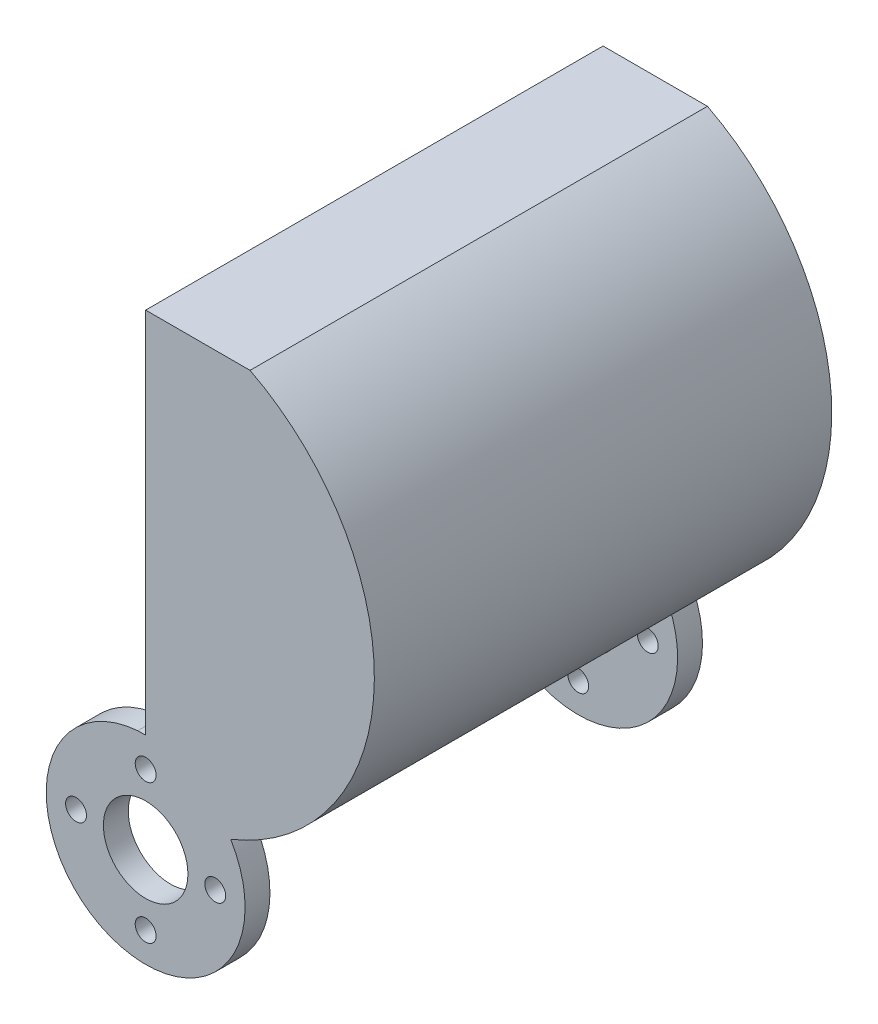
ISO-10303-21;
HEADER;
FILE_DESCRIPTION(('STEP AP214'),'2;1');
FILE_NAME('part.step','',(''),(''),'','','');
FILE_SCHEMA(('AUTOMOTIVE_DESIGN { 1 0 10303 214 1 1 1 1 }'));
ENDSEC;
DATA;
#1=APPLICATION_CONTEXT('core data for automotive mechanical design processes');
#2=APPLICATION_PROTOCOL_DEFINITION('international standard','automotive_design',2000,#1);
#3=PRODUCT_CONTEXT('',#1,'mechanical');
#4=PRODUCT('Part','Part','',(#3));
#5=PRODUCT_RELATED_PRODUCT_CATEGORY('part','',(#4));
#6=PRODUCT_DEFINITION_FORMATION('','',#4);
#7=PRODUCT_DEFINITION_CONTEXT('part definition',#1,'design');
#8=PRODUCT_DEFINITION('design','',#6,#7);
#9=PRODUCT_DEFINITION_SHAPE('','',#8);
#10=(LENGTH_UNIT() NAMED_UNIT(*) SI_UNIT(.MILLI.,.METRE.));
#11=(NAMED_UNIT(*) PLANE_ANGLE_UNIT() SI_UNIT($,.RADIAN.));
#12=(NAMED_UNIT(*) SI_UNIT($,.STERADIAN.) SOLID_ANGLE_UNIT());
#13=UNCERTAINTY_MEASURE_WITH_UNIT(LENGTH_MEASURE(1.E-05),#10,'distance_accuracy_value','');
#14=(GEOMETRIC_REPRESENTATION_CONTEXT(3) GLOBAL_UNCERTAINTY_ASSIGNED_CONTEXT((#13)) GLOBAL_UNIT_ASSIGNED_CONTEXT((#10,
#11,#12)) REPRESENTATION_CONTEXT('',''));
#15=CARTESIAN_POINT('',(0.,0.,0.));
#16=DIRECTION('',(0.,0.,1.));
#17=DIRECTION('',(1.,0.,0.));
#18=AXIS2_PLACEMENT_3D('',#15,#16,#17);
#19=CARTESIAN_POINT('',(0.,26.5366180703189,23.));
#20=DIRECTION('',(0.,0.,-1.));
#21=DIRECTION('',(-1.,0.,0.));
#22=AXIS2_PLACEMENT_3D('',#19,#20,#21);
#23=CYLINDRICAL_SURFACE('',#22,20.);
#24=CARTESIAN_POINT('',(0.,26.5366180703189,21.));
#25=DIRECTION('',(0.,0.,1.));
#26=DIRECTION('',(1.,0.,0.));
#27=AXIS2_PLACEMENT_3D('',#24,#25,#26);
#28=CIRCLE('',#27,20.);
#29=CARTESIAN_POINT('',(11.2019848851942,9.96810773800832,21.));
#30=VERTEX_POINT('',#29);
#31=CARTESIAN_POINT('',(18.8925108229469,19.9736130570011,21.));
#32=VERTEX_POINT('',#31);
#33=EDGE_CURVE('E281',#30,#32,#28,.T.);
#34=ORIENTED_EDGE('',*,*,#33,.T.);
#35=DIRECTION('',(0.,0.,-1.));
#36=VECTOR('',#35,1.);
#37=CARTESIAN_POINT('',(18.8925108229469,19.9736130570011,40.8613024708278));
#38=LINE('',#37,#36);
#39=CARTESIAN_POINT('',(18.8925108229469,19.9736130570011,-21.));
#40=VERTEX_POINT('',#39);
#41=EDGE_CURVE('E199',#32,#40,#38,.T.);
#42=ORIENTED_EDGE('',*,*,#41,.T.);
#43=CARTESIAN_POINT('',(0.,26.5366180703189,-21.));
#44=DIRECTION('',(0.,0.,1.));
#45=DIRECTION('',(1.,0.,0.));
#46=AXIS2_PLACEMENT_3D('',#43,#44,#45);
#47=CIRCLE('',#46,20.);
#48=CARTESIAN_POINT('',(11.2019848851942,9.96810773800832,-21.));
#49=VERTEX_POINT('',#48);
#50=EDGE_CURVE('E263',#49,#40,#47,.T.);
#51=ORIENTED_EDGE('',*,*,#50,.F.);
#52=DIRECTION('',(0.,0.,-1.));
#53=VECTOR('',#52,1.);
#54=CARTESIAN_POINT('',(11.2019848851942,9.96810773800832,23.));
#55=LINE('',#54,#53);
#56=EDGE_CURVE('E319',#30,#49,#55,.T.);
#57=ORIENTED_EDGE('',*,*,#56,.F.);
#58=EDGE_LOOP('',(#34,#42,#51,#57));
#59=FACE_BOUND('',#58,.T.);
#60=ADVANCED_FACE('F45',(#59),#23,.F.);
#61=CARTESIAN_POINT('',(19.6542616371196,22.8339164215697,-21.));
#62=VERTEX_POINT('',#61);
#63=CARTESIAN_POINT('',(7.6878818746599,45.,-21.));
#64=VERTEX_POINT('',#63);
#65=EDGE_CURVE('E262',#62,#64,#47,.T.);
#66=ORIENTED_EDGE('',*,*,#65,.F.);
#67=DIRECTION('',(0.,0.,-1.));
#68=VECTOR('',#67,1.);
#69=CARTESIAN_POINT('',(19.6542616371196,22.8339164215697,40.8613024708278));
#70=LINE('',#69,#68);
#71=CARTESIAN_POINT('',(19.6542616371196,22.8339164215697,21.));
#72=VERTEX_POINT('',#71);
#73=EDGE_CURVE('E60',#72,#62,#70,.T.);
#74=ORIENTED_EDGE('',*,*,#73,.F.);
#75=CARTESIAN_POINT('',(7.6878818746599,45.,21.));
#76=VERTEX_POINT('',#75);
#77=EDGE_CURVE('E280',#72,#76,#28,.T.);
#78=ORIENTED_EDGE('',*,*,#77,.T.);
#79=DIRECTION('',(0.,0.,-1.));
#80=VECTOR('',#79,1.);
#81=CARTESIAN_POINT('',(7.6878818746599,45.,23.));
#82=LINE('',#81,#80);
#83=EDGE_CURVE('E347',#76,#64,#82,.T.);
#84=ORIENTED_EDGE('',*,*,#83,.T.);
#85=EDGE_LOOP('',(#66,#74,#78,#84));
#86=FACE_BOUND('',#85,.T.);
#87=ADVANCED_FACE('F417',(#86),#23,.F.);
#88=CARTESIAN_POINT('',(0.,26.5366180703189,21.));
#89=DIRECTION('',(0.,0.,1.));
#90=DIRECTION('',(1.,0.,0.));
#91=AXIS2_PLACEMENT_3D('',#88,#89,#90);
#92=PLANE('',#91);
#93=DIRECTION('',(1.,0.,0.));
#94=VECTOR('',#93,1.);
#95=CARTESIAN_POINT('',(0.,19.9736130570011,21.));
#96=LINE('',#95,#94);
#97=CARTESIAN_POINT('',(0.,19.9736130570011,21.));
#98=VERTEX_POINT('',#97);
#99=EDGE_CURVE('E68',#98,#32,#96,.T.);
#100=ORIENTED_EDGE('',*,*,#99,.T.);
#101=ORIENTED_EDGE('',*,*,#33,.F.);
#102=DIRECTION('',(1.,0.,0.));
#103=VECTOR('',#102,1.);
#104=CARTESIAN_POINT('',(11.2019848851942,9.96810773800832,21.));
#105=LINE('',#104,#103);
#106=CARTESIAN_POINT('',(0.,9.96810773800832,21.));
#107=VERTEX_POINT('',#106);
#108=EDGE_CURVE('E277',#107,#30,#105,.T.);
#109=ORIENTED_EDGE('',*,*,#108,.F.);
#110=DIRECTION('',(0.,-1.,0.));
#111=VECTOR('',#110,1.);
#112=CARTESIAN_POINT('',(0.,47.,21.));
#113=LINE('',#112,#111);
#114=EDGE_CURVE('E278',#98,#107,#113,.T.);
#115=ORIENTED_EDGE('',*,*,#114,.F.);
#116=EDGE_LOOP('',(#100,#101,#109,#115));
#117=FACE_BOUND('',#116,.T.);
#118=ADVANCED_FACE('F424',(#117),#92,.F.);
#119=DIRECTION('',(-1.,0.,0.));
#120=VECTOR('',#119,1.);
#121=CARTESIAN_POINT('',(0.,22.8339164215697,21.));
#122=LINE('',#121,#120);
#123=CARTESIAN_POINT('',(0.,22.8339164215697,21.));
#124=VERTEX_POINT('',#123);
#125=EDGE_CURVE('E196',#72,#124,#122,.T.);
#126=ORIENTED_EDGE('',*,*,#125,.T.);
#127=CARTESIAN_POINT('',(0.,47.,21.));
#128=VERTEX_POINT('',#127);
#129=EDGE_CURVE('E190',#128,#124,#113,.T.);
#130=ORIENTED_EDGE('',*,*,#129,.F.);
#131=DIRECTION('',(-0.866025403784438,0.500000000000001,0.));
#132=VECTOR('',#131,1.);
#133=CARTESIAN_POINT('',(0.,47.,21.));
#134=LINE('',#133,#132);
#135=CARTESIAN_POINT('',(3.46410161513775,45.,21.));
#136=VERTEX_POINT('',#135);
#137=EDGE_CURVE('E285',#136,#128,#134,.T.);
#138=ORIENTED_EDGE('',*,*,#137,.F.);
#139=DIRECTION('',(-1.,0.,0.));
#140=VECTOR('',#139,1.);
#141=CARTESIAN_POINT('',(3.46410161513775,45.,21.));
#142=LINE('',#141,#140);
#143=EDGE_CURVE('E283',#76,#136,#142,.T.);
#144=ORIENTED_EDGE('',*,*,#143,.F.);
#145=ORIENTED_EDGE('',*,*,#77,.F.);
#146=EDGE_LOOP('',(#126,#130,#138,#144,#145));
#147=FACE_BOUND('',#146,.T.);
#148=ADVANCED_FACE('F486',(#147),#92,.F.);
#149=CARTESIAN_POINT('',(0.,26.5366180703189,-21.));
#150=DIRECTION('',(0.,0.,-1.));
#151=DIRECTION('',(1.,0.,0.));
#152=AXIS2_PLACEMENT_3D('',#149,#150,#151);
#153=PLANE('',#152);
#154=DIRECTION('',(1.,0.,0.));
#155=VECTOR('',#154,1.);
#156=CARTESIAN_POINT('',(0.,19.9736130570011,-21.));
#157=LINE('',#156,#155);
#158=CARTESIAN_POINT('',(0.,19.9736130570011,-21.));
#159=VERTEX_POINT('',#158);
#160=EDGE_CURVE('E202',#159,#40,#157,.T.);
#161=ORIENTED_EDGE('',*,*,#160,.F.);
#162=DIRECTION('',(0.,-1.,0.));
#163=VECTOR('',#162,1.);
#164=CARTESIAN_POINT('',(0.,47.,-21.));
#165=LINE('',#164,#163);
#166=CARTESIAN_POINT('',(0.,9.96810773800832,-21.));
#167=VERTEX_POINT('',#166);
#168=EDGE_CURVE('E181',#159,#167,#165,.T.);
#169=ORIENTED_EDGE('',*,*,#168,.T.);
#170=DIRECTION('',(1.,0.,0.));
#171=VECTOR('',#170,1.);
#172=CARTESIAN_POINT('',(11.2019848851942,9.96810773800832,-21.));
#173=LINE('',#172,#171);
#174=EDGE_CURVE('E266',#167,#49,#173,.T.);
#175=ORIENTED_EDGE('',*,*,#174,.T.);
#176=ORIENTED_EDGE('',*,*,#50,.T.);
#177=EDGE_LOOP('',(#161,#169,#175,#176));
#178=FACE_BOUND('',#177,.T.);
#179=ADVANCED_FACE('F474',(#178),#153,.F.);
#180=DIRECTION('',(-1.,0.,0.));
#181=VECTOR('',#180,1.);
#182=CARTESIAN_POINT('',(0.,22.8339164215697,-21.));
#183=LINE('',#182,#181);
#184=CARTESIAN_POINT('',(0.,22.8339164215697,-21.));
#185=VERTEX_POINT('',#184);
#186=EDGE_CURVE('E176',#62,#185,#183,.T.);
#187=ORIENTED_EDGE('',*,*,#186,.F.);
#188=ORIENTED_EDGE('',*,*,#65,.T.);
#189=DIRECTION('',(-1.,0.,0.));
#190=VECTOR('',#189,1.);
#191=CARTESIAN_POINT('',(3.46410161513775,45.,-21.));
#192=LINE('',#191,#190);
#193=CARTESIAN_POINT('',(3.46410161513775,45.,-21.));
#194=VERTEX_POINT('',#193);
#195=EDGE_CURVE('E260',#64,#194,#192,.T.);
#196=ORIENTED_EDGE('',*,*,#195,.T.);
#197=DIRECTION('',(-0.866025403784438,0.500000000000001,0.));
#198=VECTOR('',#197,1.);
#199=CARTESIAN_POINT('',(0.,47.,-21.));
#200=LINE('',#199,#198);
#201=CARTESIAN_POINT('',(0.,47.,-21.));
#202=VERTEX_POINT('',#201);
#203=EDGE_CURVE('E178',#194,#202,#200,.T.);
#204=ORIENTED_EDGE('',*,*,#203,.T.);
#205=EDGE_CURVE('E172',#202,#185,#165,.T.);
#206=ORIENTED_EDGE('',*,*,#205,.T.);
#207=EDGE_LOOP('',(#187,#188,#196,#204,#206));
#208=FACE_BOUND('',#207,.T.);
#209=ADVANCED_FACE('F174',(#208),#153,.F.);
#210=CARTESIAN_POINT('',(0.,0.,23.));
#211=DIRECTION('',(0.,0.,-1.));
#212=DIRECTION('',(-1.,0.,0.));
#213=AXIS2_PLACEMENT_3D('',#210,#211,#212);
#214=CYLINDRICAL_SURFACE('',#213,10.);
#215=DIRECTION('',(0.,0.,-1.));
#216=VECTOR('',#215,1.);
#217=CARTESIAN_POINT('',(-0.798015114805841,9.96810773800832,23.));
#218=LINE('',#217,#216);
#219=CARTESIAN_POINT('',(-0.798015114805841,9.96810773800832,23.));
#220=VERTEX_POINT('',#219);
#221=CARTESIAN_POINT('',(-0.798015114805853,9.96810773800832,20.5));
#222=VERTEX_POINT('',#221);
#223=EDGE_CURVE('E53',#220,#222,#218,.T.);
#224=ORIENTED_EDGE('',*,*,#223,.T.);
#225=CARTESIAN_POINT('',(0.,0.,20.5));
#226=DIRECTION('',(0.,0.,1.));
#227=DIRECTION('',(1.,0.,0.));
#228=AXIS2_PLACEMENT_3D('',#225,#226,#227);
#229=CIRCLE('',#228,10.);
#230=CARTESIAN_POINT('',(8.55069208344234,5.18513885003635,20.5));
#231=VERTEX_POINT('',#230);
#232=EDGE_CURVE('E238',#222,#231,#229,.T.);
#233=ORIENTED_EDGE('',*,*,#232,.T.);
#234=DIRECTION('',(0.,0.,-1.));
#235=VECTOR('',#234,1.);
#236=CARTESIAN_POINT('',(8.55069208344234,5.18513885003635,23.));
#237=LINE('',#236,#235);
#238=CARTESIAN_POINT('',(8.55069208344234,5.18513885003635,23.));
#239=VERTEX_POINT('',#238);
#240=EDGE_CURVE('E359',#239,#231,#237,.T.);
#241=ORIENTED_EDGE('',*,*,#240,.F.);
#242=CARTESIAN_POINT('',(0.,0.,23.));
#243=DIRECTION('',(0.,0.,1.));
#244=DIRECTION('',(1.,0.,0.));
#245=AXIS2_PLACEMENT_3D('',#242,#243,#244);
#246=CIRCLE('',#245,10.);
#247=EDGE_CURVE('E311',#220,#239,#246,.T.);
#248=ORIENTED_EDGE('',*,*,#247,.F.);
#249=EDGE_LOOP('',(#224,#233,#241,#248));
#250=FACE_BOUND('',#249,.T.);
#251=ADVANCED_FACE('F396',(#250),#214,.T.);
#252=CARTESIAN_POINT('',(-7.,0.,23.));
#253=DIRECTION('',(0.,0.,-1.));
#254=DIRECTION('',(-1.,0.,0.));
#255=AXIS2_PLACEMENT_3D('',#252,#253,#254);
#256=CYLINDRICAL_SURFACE('',#255,1.05);
#257=CARTESIAN_POINT('',(-7.,0.,-20.5));
#258=DIRECTION('',(0.,0.,-1.));
#259=DIRECTION('',(-1.,0.,0.));
#260=AXIS2_PLACEMENT_3D('',#257,#258,#259);
#261=CIRCLE('',#260,1.05);
#262=CARTESIAN_POINT('',(-8.05,0.,-20.5));
#263=VERTEX_POINT('',#262);
#264=EDGE_CURVE('E250',#263,#263,#261,.T.);
#265=ORIENTED_EDGE('',*,*,#264,.F.);
#266=EDGE_LOOP('',(#265));
#267=FACE_BOUND('',#266,.T.);
#268=CARTESIAN_POINT('',(-7.,0.,-23.));
#269=DIRECTION('',(0.,0.,1.));
#270=DIRECTION('',(1.,0.,0.));
#271=AXIS2_PLACEMENT_3D('',#268,#269,#270);
#272=CIRCLE('',#271,1.05);
#273=CARTESIAN_POINT('',(-5.95,0.,-23.));
#274=VERTEX_POINT('',#273);
#275=EDGE_CURVE('E331',#274,#274,#272,.T.);
#276=ORIENTED_EDGE('',*,*,#275,.F.);
#277=EDGE_LOOP('',(#276));
#278=FACE_BOUND('',#277,.T.);
#279=ADVANCED_FACE('F393',(#267,#278),#256,.F.);
#280=CARTESIAN_POINT('',(0.,-7.,23.));
#281=DIRECTION('',(0.,0.,-1.));
#282=DIRECTION('',(-1.,0.,0.));
#283=AXIS2_PLACEMENT_3D('',#280,#281,#282);
#284=CYLINDRICAL_SURFACE('',#283,1.05);
#285=CARTESIAN_POINT('',(0.,-7.,-20.5));
#286=DIRECTION('',(0.,0.,-1.));
#287=DIRECTION('',(-1.,0.,0.));
#288=AXIS2_PLACEMENT_3D('',#285,#286,#287);
#289=CIRCLE('',#288,1.05);
#290=CARTESIAN_POINT('',(-1.05000000000005,-7.,-20.5));
#291=VERTEX_POINT('',#290);
#292=EDGE_CURVE('E247',#291,#291,#289,.T.);
#293=ORIENTED_EDGE('',*,*,#292,.F.);
#294=EDGE_LOOP('',(#293));
#295=FACE_BOUND('',#294,.T.);
#296=CARTESIAN_POINT('',(0.,-7.,-23.));
#297=DIRECTION('',(0.,0.,1.));
#298=DIRECTION('',(1.,0.,0.));
#299=AXIS2_PLACEMENT_3D('',#296,#297,#298);
#300=CIRCLE('',#299,1.05);
#301=CARTESIAN_POINT('',(1.04999999999995,-7.,-23.));
#302=VERTEX_POINT('',#301);
#303=EDGE_CURVE('E328',#302,#302,#300,.T.);
#304=ORIENTED_EDGE('',*,*,#303,.F.);
#305=EDGE_LOOP('',(#304));
#306=FACE_BOUND('',#305,.T.);
#307=ADVANCED_FACE('F395',(#295,#306),#284,.F.);
#308=CARTESIAN_POINT('',(7.,0.,23.));
#309=DIRECTION('',(0.,0.,-1.));
#310=DIRECTION('',(-1.,0.,0.));
#311=AXIS2_PLACEMENT_3D('',#308,#309,#310);
#312=CYLINDRICAL_SURFACE('',#311,1.05);
#313=CARTESIAN_POINT('',(7.,0.,-20.5));
#314=DIRECTION('',(0.,0.,-1.));
#315=DIRECTION('',(-1.,0.,0.));
#316=AXIS2_PLACEMENT_3D('',#313,#314,#315);
#317=CIRCLE('',#316,1.05);
#318=CARTESIAN_POINT('',(5.95,0.,-20.5));
#319=VERTEX_POINT('',#318);
#320=EDGE_CURVE('E244',#319,#319,#317,.T.);
#321=ORIENTED_EDGE('',*,*,#320,.F.);
#322=EDGE_LOOP('',(#321));
#323=FACE_BOUND('',#322,.T.);
#324=CARTESIAN_POINT('',(7.,0.,-23.));
#325=DIRECTION('',(0.,0.,1.));
#326=DIRECTION('',(1.,0.,0.));
#327=AXIS2_PLACEMENT_3D('',#324,#325,#326);
#328=CIRCLE('',#327,1.05);
#329=CARTESIAN_POINT('',(8.05,0.,-23.));
#330=VERTEX_POINT('',#329);
#331=EDGE_CURVE('E325',#330,#330,#328,.T.);
#332=ORIENTED_EDGE('',*,*,#331,.F.);
#333=EDGE_LOOP('',(#332));
#334=FACE_BOUND('',#333,.T.);
#335=ADVANCED_FACE('F404',(#323,#334),#312,.F.);
#336=CARTESIAN_POINT('',(0.,7.,23.));
#337=DIRECTION('',(0.,0.,-1.));
#338=DIRECTION('',(-1.,0.,0.));
#339=AXIS2_PLACEMENT_3D('',#336,#337,#338);
#340=CYLINDRICAL_SURFACE('',#339,1.05);
#341=CARTESIAN_POINT('',(0.,7.,-20.5));
#342=DIRECTION('',(0.,0.,-1.));
#343=DIRECTION('',(-1.,0.,0.));
#344=AXIS2_PLACEMENT_3D('',#341,#342,#343);
#345=CIRCLE('',#344,1.05);
#346=CARTESIAN_POINT('',(-1.05,7.,-20.5));
#347=VERTEX_POINT('',#346);
#348=EDGE_CURVE('E241',#347,#347,#345,.T.);
#349=ORIENTED_EDGE('',*,*,#348,.F.);
#350=EDGE_LOOP('',(#349));
#351=FACE_BOUND('',#350,.T.);
#352=CARTESIAN_POINT('',(0.,7.,-23.));
#353=DIRECTION('',(0.,0.,1.));
#354=DIRECTION('',(1.,0.,0.));
#355=AXIS2_PLACEMENT_3D('',#352,#353,#354);
#356=CIRCLE('',#355,1.05);
#357=CARTESIAN_POINT('',(1.05,7.,-23.));
#358=VERTEX_POINT('',#357);
#359=EDGE_CURVE('E322',#358,#358,#356,.T.);
#360=ORIENTED_EDGE('',*,*,#359,.F.);
#361=EDGE_LOOP('',(#360));
#362=FACE_BOUND('',#361,.T.);
#363=ADVANCED_FACE('F376',(#351,#362),#340,.F.);
#364=CARTESIAN_POINT('',(0.,0.,23.));
#365=DIRECTION('',(0.,0.,-1.));
#366=DIRECTION('',(-1.,0.,0.));
#367=AXIS2_PLACEMENT_3D('',#364,#365,#366);
#368=CYLINDRICAL_SURFACE('',#367,4.25);
#369=CARTESIAN_POINT('',(0.,0.,-20.5));
#370=DIRECTION('',(0.,0.,-1.));
#371=DIRECTION('',(-1.,0.,0.));
#372=AXIS2_PLACEMENT_3D('',#369,#370,#371);
#373=CIRCLE('',#372,4.25);
#374=CARTESIAN_POINT('',(-4.25,0.,-20.5));
#375=VERTEX_POINT('',#374);
#376=EDGE_CURVE('E240',#375,#375,#373,.T.);
#377=ORIENTED_EDGE('',*,*,#376,.F.);
#378=EDGE_LOOP('',(#377));
#379=FACE_BOUND('',#378,.T.);
#380=CARTESIAN_POINT('',(0.,0.,-23.));
#381=DIRECTION('',(0.,0.,1.));
#382=DIRECTION('',(1.,0.,0.));
#383=AXIS2_PLACEMENT_3D('',#380,#381,#382);
#384=CIRCLE('',#383,4.25);
#385=CARTESIAN_POINT('',(4.25,0.,-23.));
#386=VERTEX_POINT('',#385);
#387=EDGE_CURVE('E292',#386,#386,#384,.T.);
#388=ORIENTED_EDGE('',*,*,#387,.F.);
#389=EDGE_LOOP('',(#388));
#390=FACE_BOUND('',#389,.T.);
#391=ADVANCED_FACE('F372',(#379,#390),#368,.F.);
#392=CARTESIAN_POINT('',(20.3515969889343,35.25,23.));
#393=DIRECTION('',(0.500000000000001,0.866025403784438,0.));
#394=DIRECTION('',(-0.866025403784438,0.500000000000001,0.));
#395=AXIS2_PLACEMENT_3D('',#392,#393,#394);
#396=PLANE('',#395);
#397=ORIENTED_EDGE('',*,*,#203,.F.);
#398=DIRECTION('',(0.,0.,-1.));
#399=VECTOR('',#398,1.);
#400=CARTESIAN_POINT('',(3.46410161513775,45.,23.));
#401=LINE('',#400,#399);
#402=EDGE_CURVE('E350',#136,#194,#401,.T.);
#403=ORIENTED_EDGE('',*,*,#402,.F.);
#404=ORIENTED_EDGE('',*,*,#137,.T.);
#405=DIRECTION('',(0.,0.,-1.));
#406=VECTOR('',#405,1.);
#407=CARTESIAN_POINT('',(0.,47.,23.));
#408=LINE('',#407,#406);
#409=EDGE_CURVE('E353',#128,#202,#408,.T.);
#410=ORIENTED_EDGE('',*,*,#409,.T.);
#411=EDGE_LOOP('',(#397,#403,#404,#410));
#412=FACE_BOUND('',#411,.T.);
#413=ADVANCED_FACE('F375',(#412),#396,.F.);
#414=CARTESIAN_POINT('',(0.,45.,23.));
#415=DIRECTION('',(0.,1.,0.));
#416=DIRECTION('',(-1.,0.,0.));
#417=AXIS2_PLACEMENT_3D('',#414,#415,#416);
#418=PLANE('',#417);
#419=ORIENTED_EDGE('',*,*,#195,.F.);
#420=ORIENTED_EDGE('',*,*,#83,.F.);
#421=ORIENTED_EDGE('',*,*,#143,.T.);
#422=ORIENTED_EDGE('',*,*,#402,.T.);
#423=EDGE_LOOP('',(#419,#420,#421,#422));
#424=FACE_BOUND('',#423,.T.);
#425=ADVANCED_FACE('F427',(#424),#418,.F.);
#426=CARTESIAN_POINT('',(0.,9.96810773800832,23.));
#427=DIRECTION('',(0.,1.,0.));
#428=DIRECTION('',(0.,0.,1.));
#429=AXIS2_PLACEMENT_3D('',#426,#427,#428);
#430=PLANE('',#429);
#431=DIRECTION('',(-1.,0.,0.));
#432=VECTOR('',#431,1.);
#433=CARTESIAN_POINT('',(-10.5,9.96810773800832,-20.5));
#434=LINE('',#433,#432);
#435=CARTESIAN_POINT('',(10.5,9.96810773800832,-20.5));
#436=VERTEX_POINT('',#435);
#437=CARTESIAN_POINT('',(-0.798015114805853,9.96810773800832,-20.5));
#438=VERTEX_POINT('',#437);
#439=EDGE_CURVE('E215',#436,#438,#434,.T.);
#440=ORIENTED_EDGE('',*,*,#439,.F.);
#441=DIRECTION('',(0.,0.,-1.));
#442=VECTOR('',#441,1.);
#443=CARTESIAN_POINT('',(10.5,9.96810773800832,-20.5));
#444=LINE('',#443,#442);
#445=CARTESIAN_POINT('',(10.5,9.96810773800832,20.5));
#446=VERTEX_POINT('',#445);
#447=EDGE_CURVE('E212',#446,#436,#444,.T.);
#448=ORIENTED_EDGE('',*,*,#447,.F.);
#449=DIRECTION('',(1.,0.,0.));
#450=VECTOR('',#449,1.);
#451=CARTESIAN_POINT('',(-10.5,9.96810773800832,20.5));
#452=LINE('',#451,#450);
#453=EDGE_CURVE('E205',#222,#446,#452,.T.);
#454=ORIENTED_EDGE('',*,*,#453,.F.);
#455=ORIENTED_EDGE('',*,*,#223,.F.);
#456=DIRECTION('',(1.,0.,0.));
#457=VECTOR('',#456,1.);
#458=CARTESIAN_POINT('',(0.,9.96810773800832,23.));
#459=LINE('',#458,#457);
#460=CARTESIAN_POINT('',(0.,9.96810773800832,23.));
#461=VERTEX_POINT('',#460);
#462=EDGE_CURVE('E309',#220,#461,#459,.T.);
#463=ORIENTED_EDGE('',*,*,#462,.T.);
#464=DIRECTION('',(0.,0.,1.));
#465=VECTOR('',#464,1.);
#466=CARTESIAN_POINT('',(0.,9.96810773800832,21.));
#467=LINE('',#466,#465);
#468=EDGE_CURVE('E287',#107,#461,#467,.T.);
#469=ORIENTED_EDGE('',*,*,#468,.F.);
#470=ORIENTED_EDGE('',*,*,#108,.T.);
#471=ORIENTED_EDGE('',*,*,#56,.T.);
#472=ORIENTED_EDGE('',*,*,#174,.F.);
#473=DIRECTION('',(0.,0.,-1.));
#474=VECTOR('',#473,1.);
#475=CARTESIAN_POINT('',(0.,9.96810773800832,-21.));
#476=LINE('',#475,#474);
#477=CARTESIAN_POINT('',(0.,9.96810773800832,-23.));
#478=VERTEX_POINT('',#477);
#479=EDGE_CURVE('E272',#167,#478,#476,.T.);
#480=ORIENTED_EDGE('',*,*,#479,.T.);
#481=DIRECTION('',(1.,0.,0.));
#482=VECTOR('',#481,1.);
#483=CARTESIAN_POINT('',(0.,9.96810773800832,-23.));
#484=LINE('',#483,#482);
#485=CARTESIAN_POINT('',(-0.798015114805841,9.96810773800832,-23.));
#486=VERTEX_POINT('',#485);
#487=EDGE_CURVE('E334',#486,#478,#484,.T.);
#488=ORIENTED_EDGE('',*,*,#487,.F.);
#489=EDGE_CURVE('E362',#438,#486,#218,.T.);
#490=ORIENTED_EDGE('',*,*,#489,.F.);
#491=EDGE_LOOP('',(#440,#448,#454,#455,#463,#469,#470,#471,#472,#480,#488,#490));
#492=FACE_BOUND('',#491,.T.);
#493=ADVANCED_FACE('F430',(#492),#430,.T.);
#494=CARTESIAN_POINT('',(8.55069208344234,5.18513885003635,-20.5));
#495=VERTEX_POINT('',#494);
#496=CARTESIAN_POINT('',(8.55069208344234,5.18513885003635,-23.));
#497=VERTEX_POINT('',#496);
#498=EDGE_CURVE('E358',#495,#497,#237,.T.);
#499=ORIENTED_EDGE('',*,*,#498,.F.);
#500=CARTESIAN_POINT('',(0.,0.,-20.5));
#501=DIRECTION('',(0.,0.,-1.));
#502=DIRECTION('',(-1.,0.,0.));
#503=AXIS2_PLACEMENT_3D('',#500,#501,#502);
#504=CIRCLE('',#503,10.);
#505=EDGE_CURVE('E256',#495,#438,#504,.T.);
#506=ORIENTED_EDGE('',*,*,#505,.T.);
#507=ORIENTED_EDGE('',*,*,#489,.T.);
#508=CARTESIAN_POINT('',(0.,0.,-23.));
#509=DIRECTION('',(0.,0.,1.));
#510=DIRECTION('',(1.,0.,0.));
#511=AXIS2_PLACEMENT_3D('',#508,#509,#510);
#512=CIRCLE('',#511,10.);
#513=EDGE_CURVE('E337',#486,#497,#512,.T.);
#514=ORIENTED_EDGE('',*,*,#513,.T.);
#515=EDGE_LOOP('',(#499,#506,#507,#514));
#516=FACE_BOUND('',#515,.T.);
#517=ADVANCED_FACE('F410',(#516),#214,.T.);
#518=CARTESIAN_POINT('',(0.,26.5366180703189,23.));
#519=DIRECTION('',(0.,0.,-1.));
#520=DIRECTION('',(-1.,0.,0.));
#521=AXIS2_PLACEMENT_3D('',#518,#519,#520);
#522=CYLINDRICAL_SURFACE('',#521,23.);
#523=DIRECTION('',(0.,0.,-1.));
#524=VECTOR('',#523,1.);
#525=CARTESIAN_POINT('',(10.5,6.07323614063775,23.));
#526=LINE('',#525,#524);
#527=CARTESIAN_POINT('',(10.5,6.07323614063775,20.5));
#528=VERTEX_POINT('',#527);
#529=CARTESIAN_POINT('',(10.5,6.07323614063774,-20.5));
#530=VERTEX_POINT('',#529);
#531=EDGE_CURVE('E11',#528,#530,#526,.T.);
#532=ORIENTED_EDGE('',*,*,#531,.T.);
#533=CARTESIAN_POINT('',(0.,26.5366180703189,-20.5));
#534=DIRECTION('',(0.,0.,-1.));
#535=DIRECTION('',(-1.,0.,0.));
#536=AXIS2_PLACEMENT_3D('',#533,#534,#535);
#537=CIRCLE('',#536,23.);
#538=EDGE_CURVE('E253',#530,#495,#537,.T.);
#539=ORIENTED_EDGE('',*,*,#538,.T.);
#540=ORIENTED_EDGE('',*,*,#498,.T.);
#541=CARTESIAN_POINT('',(0.,26.5366180703189,-23.));
#542=DIRECTION('',(0.,0.,1.));
#543=DIRECTION('',(1.,0.,0.));
#544=AXIS2_PLACEMENT_3D('',#541,#542,#543);
#545=CIRCLE('',#544,23.);
#546=CARTESIAN_POINT('',(10.5,47.,-23.));
#547=VERTEX_POINT('',#546);
#548=EDGE_CURVE('E340',#497,#547,#545,.T.);
#549=ORIENTED_EDGE('',*,*,#548,.T.);
#550=DIRECTION('',(0.,0.,-1.));
#551=VECTOR('',#550,1.);
#552=CARTESIAN_POINT('',(10.5,47.,23.));
#553=LINE('',#552,#551);
#554=CARTESIAN_POINT('',(10.5,47.,23.));
#555=VERTEX_POINT('',#554);
#556=EDGE_CURVE('E356',#555,#547,#553,.T.);
#557=ORIENTED_EDGE('',*,*,#556,.F.);
#558=CARTESIAN_POINT('',(0.,26.5366180703189,23.));
#559=DIRECTION('',(0.,0.,1.));
#560=DIRECTION('',(1.,0.,0.));
#561=AXIS2_PLACEMENT_3D('',#558,#559,#560);
#562=CIRCLE('',#561,23.);
#563=EDGE_CURVE('E314',#239,#555,#562,.T.);
#564=ORIENTED_EDGE('',*,*,#563,.F.);
#565=ORIENTED_EDGE('',*,*,#240,.T.);
#566=CARTESIAN_POINT('',(0.,26.5366180703189,20.5));
#567=DIRECTION('',(0.,0.,1.));
#568=DIRECTION('',(1.,0.,0.));
#569=AXIS2_PLACEMENT_3D('',#566,#567,#568);
#570=CIRCLE('',#569,23.);
#571=EDGE_CURVE('E235',#231,#528,#570,.T.);
#572=ORIENTED_EDGE('',*,*,#571,.T.);
#573=EDGE_LOOP('',(#532,#539,#540,#549,#557,#564,#565,#572));
#574=FACE_BOUND('',#573,.T.);
#575=ADVANCED_FACE('F437',(#574),#522,.T.);
#576=CARTESIAN_POINT('',(0.,47.,23.));
#577=DIRECTION('',(0.,1.,0.));
#578=DIRECTION('',(0.,0.,1.));
#579=AXIS2_PLACEMENT_3D('',#576,#577,#578);
#580=PLANE('',#579);
#581=DIRECTION('',(1.,0.,0.));
#582=VECTOR('',#581,1.);
#583=CARTESIAN_POINT('',(0.,47.,-23.));
#584=LINE('',#583,#582);
#585=CARTESIAN_POINT('',(0.,47.,-23.));
#586=VERTEX_POINT('',#585);
#587=EDGE_CURVE('E297',#586,#547,#584,.T.);
#588=ORIENTED_EDGE('',*,*,#587,.F.);
#589=DIRECTION('',(0.,0.,-1.));
#590=VECTOR('',#589,1.);
#591=CARTESIAN_POINT('',(0.,47.,-21.));
#592=LINE('',#591,#590);
#593=EDGE_CURVE('E269',#202,#586,#592,.T.);
#594=ORIENTED_EDGE('',*,*,#593,.F.);
#595=ORIENTED_EDGE('',*,*,#409,.F.);
#596=CARTESIAN_POINT('',(0.,47.,23.));
#597=VERTEX_POINT('',#596);
#598=EDGE_CURVE('E354',#597,#128,#408,.T.);
#599=ORIENTED_EDGE('',*,*,#598,.F.);
#600=DIRECTION('',(1.,0.,0.));
#601=VECTOR('',#600,1.);
#602=CARTESIAN_POINT('',(0.,47.,23.));
#603=LINE('',#602,#601);
#604=EDGE_CURVE('E316',#597,#555,#603,.T.);
#605=ORIENTED_EDGE('',*,*,#604,.T.);
#606=ORIENTED_EDGE('',*,*,#556,.T.);
#607=EDGE_LOOP('',(#588,#594,#595,#599,#605,#606));
#608=FACE_BOUND('',#607,.T.);
#609=ADVANCED_FACE('F414',(#608),#580,.T.);
#610=CARTESIAN_POINT('',(-7.,0.,20.5));
#611=DIRECTION('',(0.,0.,1.));
#612=DIRECTION('',(1.,0.,0.));
#613=AXIS2_PLACEMENT_3D('',#610,#611,#612);
#614=CIRCLE('',#613,1.05);
#615=CARTESIAN_POINT('',(-5.95,0.,20.5));
#616=VERTEX_POINT('',#615);
#617=EDGE_CURVE('E232',#616,#616,#614,.T.);
#618=ORIENTED_EDGE('',*,*,#617,.F.);
#619=EDGE_LOOP('',(#618));
#620=FACE_BOUND('',#619,.T.);
#621=CARTESIAN_POINT('',(-7.,0.,23.));
#622=DIRECTION('',(0.,0.,1.));
#623=DIRECTION('',(1.,0.,0.));
#624=AXIS2_PLACEMENT_3D('',#621,#622,#623);
#625=CIRCLE('',#624,1.05);
#626=CARTESIAN_POINT('',(-5.95,0.,23.));
#627=VERTEX_POINT('',#626);
#628=EDGE_CURVE('E306',#627,#627,#625,.T.);
#629=ORIENTED_EDGE('',*,*,#628,.T.);
#630=EDGE_LOOP('',(#629));
#631=FACE_BOUND('',#630,.T.);
#632=ADVANCED_FACE('F399',(#620,#631),#256,.F.);
#633=CARTESIAN_POINT('',(0.,-7.,20.5));
#634=DIRECTION('',(0.,0.,1.));
#635=DIRECTION('',(1.,0.,0.));
#636=AXIS2_PLACEMENT_3D('',#633,#634,#635);
#637=CIRCLE('',#636,1.05);
#638=CARTESIAN_POINT('',(1.04999999999995,-7.,20.5));
#639=VERTEX_POINT('',#638);
#640=EDGE_CURVE('E229',#639,#639,#637,.T.);
#641=ORIENTED_EDGE('',*,*,#640,.F.);
#642=EDGE_LOOP('',(#641));
#643=FACE_BOUND('',#642,.T.);
#644=CARTESIAN_POINT('',(0.,-7.,23.));
#645=DIRECTION('',(0.,0.,1.));
#646=DIRECTION('',(1.,0.,0.));
#647=AXIS2_PLACEMENT_3D('',#644,#645,#646);
#648=CIRCLE('',#647,1.05);
#649=CARTESIAN_POINT('',(1.04999999999995,-7.,23.));
#650=VERTEX_POINT('',#649);
#651=EDGE_CURVE('E303',#650,#650,#648,.T.);
#652=ORIENTED_EDGE('',*,*,#651,.T.);
#653=EDGE_LOOP('',(#652));
#654=FACE_BOUND('',#653,.T.);
#655=ADVANCED_FACE('F407',(#643,#654),#284,.F.);
#656=CARTESIAN_POINT('',(7.,0.,20.5));
#657=DIRECTION('',(0.,0.,1.));
#658=DIRECTION('',(1.,0.,0.));
#659=AXIS2_PLACEMENT_3D('',#656,#657,#658);
#660=CIRCLE('',#659,1.05);
#661=CARTESIAN_POINT('',(8.05,0.,20.5));
#662=VERTEX_POINT('',#661);
#663=EDGE_CURVE('E226',#662,#662,#660,.T.);
#664=ORIENTED_EDGE('',*,*,#663,.F.);
#665=EDGE_LOOP('',(#664));
#666=FACE_BOUND('',#665,.T.);
#667=CARTESIAN_POINT('',(7.,0.,23.));
#668=DIRECTION('',(0.,0.,1.));
#669=DIRECTION('',(1.,0.,0.));
#670=AXIS2_PLACEMENT_3D('',#667,#668,#669);
#671=CIRCLE('',#670,1.05);
#672=CARTESIAN_POINT('',(8.05,0.,23.));
#673=VERTEX_POINT('',#672);
#674=EDGE_CURVE('E300',#673,#673,#671,.T.);
#675=ORIENTED_EDGE('',*,*,#674,.T.);
#676=EDGE_LOOP('',(#675));
#677=FACE_BOUND('',#676,.T.);
#678=ADVANCED_FACE('F511',(#666,#677),#312,.F.);
#679=CARTESIAN_POINT('',(0.,7.,20.5));
#680=DIRECTION('',(0.,0.,1.));
#681=DIRECTION('',(1.,0.,0.));
#682=AXIS2_PLACEMENT_3D('',#679,#680,#681);
#683=CIRCLE('',#682,1.05);
#684=CARTESIAN_POINT('',(1.05,7.,20.5));
#685=VERTEX_POINT('',#684);
#686=EDGE_CURVE('E223',#685,#685,#683,.T.);
#687=ORIENTED_EDGE('',*,*,#686,.F.);
#688=EDGE_LOOP('',(#687));
#689=FACE_BOUND('',#688,.T.);
#690=CARTESIAN_POINT('',(0.,7.,23.));
#691=DIRECTION('',(0.,0.,1.));
#692=DIRECTION('',(1.,0.,0.));
#693=AXIS2_PLACEMENT_3D('',#690,#691,#692);
#694=CIRCLE('',#693,1.05);
#695=CARTESIAN_POINT('',(1.05,7.,23.));
#696=VERTEX_POINT('',#695);
#697=EDGE_CURVE('E296',#696,#696,#694,.T.);
#698=ORIENTED_EDGE('',*,*,#697,.T.);
#699=EDGE_LOOP('',(#698));
#700=FACE_BOUND('',#699,.T.);
#701=ADVANCED_FACE('F505',(#689,#700),#340,.F.);
#702=CARTESIAN_POINT('',(0.,0.,20.5));
#703=DIRECTION('',(0.,0.,1.));
#704=DIRECTION('',(1.,0.,0.));
#705=AXIS2_PLACEMENT_3D('',#702,#703,#704);
#706=CIRCLE('',#705,4.25);
#707=CARTESIAN_POINT('',(4.25,0.,20.5));
#708=VERTEX_POINT('',#707);
#709=EDGE_CURVE('E221',#708,#708,#706,.T.);
#710=ORIENTED_EDGE('',*,*,#709,.F.);
#711=EDGE_LOOP('',(#710));
#712=FACE_BOUND('',#711,.T.);
#713=CARTESIAN_POINT('',(0.,0.,23.));
#714=DIRECTION('',(0.,0.,1.));
#715=DIRECTION('',(1.,0.,0.));
#716=AXIS2_PLACEMENT_3D('',#713,#714,#715);
#717=CIRCLE('',#716,4.25);
#718=CARTESIAN_POINT('',(4.25,0.,23.));
#719=VERTEX_POINT('',#718);
#720=EDGE_CURVE('E293',#719,#719,#717,.T.);
#721=ORIENTED_EDGE('',*,*,#720,.T.);
#722=EDGE_LOOP('',(#721));
#723=FACE_BOUND('',#722,.T.);
#724=ADVANCED_FACE('F47',(#712,#723),#368,.F.);
#725=CARTESIAN_POINT('',(0.,0.,23.));
#726=DIRECTION('',(0.,0.,1.));
#727=DIRECTION('',(1.,0.,0.));
#728=AXIS2_PLACEMENT_3D('',#725,#726,#727);
#729=PLANE('',#728);
#730=ORIENTED_EDGE('',*,*,#604,.F.);
#731=DIRECTION('',(0.,-1.,0.));
#732=VECTOR('',#731,1.);
#733=CARTESIAN_POINT('',(0.,47.,23.));
#734=LINE('',#733,#732);
#735=EDGE_CURVE('E274',#597,#461,#734,.T.);
#736=ORIENTED_EDGE('',*,*,#735,.T.);
#737=ORIENTED_EDGE('',*,*,#462,.F.);
#738=ORIENTED_EDGE('',*,*,#247,.T.);
#739=ORIENTED_EDGE('',*,*,#563,.T.);
#740=EDGE_LOOP('',(#730,#736,#737,#738,#739));
#741=FACE_BOUND('',#740,.T.);
#742=ORIENTED_EDGE('',*,*,#720,.F.);
#743=EDGE_LOOP('',(#742));
#744=FACE_BOUND('',#743,.T.);
#745=ORIENTED_EDGE('',*,*,#697,.F.);
#746=EDGE_LOOP('',(#745));
#747=FACE_BOUND('',#746,.T.);
#748=ORIENTED_EDGE('',*,*,#674,.F.);
#749=EDGE_LOOP('',(#748));
#750=FACE_BOUND('',#749,.T.);
#751=ORIENTED_EDGE('',*,*,#651,.F.);
#752=EDGE_LOOP('',(#751));
#753=FACE_BOUND('',#752,.T.);
#754=ORIENTED_EDGE('',*,*,#628,.F.);
#755=EDGE_LOOP('',(#754));
#756=FACE_BOUND('',#755,.T.);
#757=ADVANCED_FACE('F382',(#741,#744,#747,#750,#753,#756),#729,.T.);
#758=CARTESIAN_POINT('',(0.,0.,-23.));
#759=DIRECTION('',(0.,0.,1.));
#760=DIRECTION('',(1.,0.,0.));
#761=AXIS2_PLACEMENT_3D('',#758,#759,#760);
#762=PLANE('',#761);
#763=ORIENTED_EDGE('',*,*,#487,.T.);
#764=DIRECTION('',(0.,-1.,0.));
#765=VECTOR('',#764,1.);
#766=CARTESIAN_POINT('',(0.,47.,-23.));
#767=LINE('',#766,#765);
#768=EDGE_CURVE('E257',#586,#478,#767,.T.);
#769=ORIENTED_EDGE('',*,*,#768,.F.);
#770=ORIENTED_EDGE('',*,*,#587,.T.);
#771=ORIENTED_EDGE('',*,*,#548,.F.);
#772=ORIENTED_EDGE('',*,*,#513,.F.);
#773=EDGE_LOOP('',(#763,#769,#770,#771,#772));
#774=FACE_BOUND('',#773,.T.);
#775=ORIENTED_EDGE('',*,*,#387,.T.);
#776=EDGE_LOOP('',(#775));
#777=FACE_BOUND('',#776,.T.);
#778=ORIENTED_EDGE('',*,*,#359,.T.);
#779=EDGE_LOOP('',(#778));
#780=FACE_BOUND('',#779,.T.);
#781=ORIENTED_EDGE('',*,*,#331,.T.);
#782=EDGE_LOOP('',(#781));
#783=FACE_BOUND('',#782,.T.);
#784=ORIENTED_EDGE('',*,*,#303,.T.);
#785=EDGE_LOOP('',(#784));
#786=FACE_BOUND('',#785,.T.);
#787=ORIENTED_EDGE('',*,*,#275,.T.);
#788=EDGE_LOOP('',(#787));
#789=FACE_BOUND('',#788,.T.);
#790=ADVANCED_FACE('F379',(#774,#777,#780,#783,#786,#789),#762,.F.);
#791=CARTESIAN_POINT('',(0.,47.,21.));
#792=DIRECTION('',(-1.,0.,0.));
#793=DIRECTION('',(0.,-1.,0.));
#794=AXIS2_PLACEMENT_3D('',#791,#792,#793);
#795=PLANE('',#794);
#796=ORIENTED_EDGE('',*,*,#735,.F.);
#797=ORIENTED_EDGE('',*,*,#598,.T.);
#798=ORIENTED_EDGE('',*,*,#129,.T.);
#799=DIRECTION('',(0.,0.,-1.));
#800=VECTOR('',#799,1.);
#801=CARTESIAN_POINT('',(0.,22.8339164215697,40.8613024708278));
#802=LINE('',#801,#800);
#803=EDGE_CURVE('E185',#124,#185,#802,.T.);
#804=ORIENTED_EDGE('',*,*,#803,.T.);
#805=ORIENTED_EDGE('',*,*,#205,.F.);
#806=ORIENTED_EDGE('',*,*,#593,.T.);
#807=ORIENTED_EDGE('',*,*,#768,.T.);
#808=ORIENTED_EDGE('',*,*,#479,.F.);
#809=ORIENTED_EDGE('',*,*,#168,.F.);
#810=DIRECTION('',(0.,0.,-1.));
#811=VECTOR('',#810,1.);
#812=CARTESIAN_POINT('',(0.,19.9736130570011,40.8613024708278));
#813=LINE('',#812,#811);
#814=EDGE_CURVE('E193',#98,#159,#813,.T.);
#815=ORIENTED_EDGE('',*,*,#814,.F.);
#816=ORIENTED_EDGE('',*,*,#114,.T.);
#817=ORIENTED_EDGE('',*,*,#468,.T.);
#818=EDGE_LOOP('',(#796,#797,#798,#804,#805,#806,#807,#808,#809,#815,#816,#817));
#819=FACE_BOUND('',#818,.T.);
#820=ADVANCED_FACE('F187',(#819),#795,.T.);
#821=CARTESIAN_POINT('',(10.5,-10.,-20.5));
#822=DIRECTION('',(1.,0.,0.));
#823=DIRECTION('',(0.,0.,-1.));
#824=AXIS2_PLACEMENT_3D('',#821,#822,#823);
#825=PLANE('',#824);
#826=DIRECTION('',(0.,1.,0.));
#827=VECTOR('',#826,1.);
#828=CARTESIAN_POINT('',(10.5,-10.,20.5));
#829=LINE('',#828,#827);
#830=EDGE_CURVE('E218',#528,#446,#829,.T.);
#831=ORIENTED_EDGE('',*,*,#830,.T.);
#832=ORIENTED_EDGE('',*,*,#447,.T.);
#833=DIRECTION('',(0.,1.,0.));
#834=VECTOR('',#833,1.);
#835=CARTESIAN_POINT('',(10.5,-10.,-20.5));
#836=LINE('',#835,#834);
#837=EDGE_CURVE('E219',#530,#436,#836,.T.);
#838=ORIENTED_EDGE('',*,*,#837,.F.);
#839=ORIENTED_EDGE('',*,*,#531,.F.);
#840=EDGE_LOOP('',(#831,#832,#838,#839));
#841=FACE_BOUND('',#840,.T.);
#842=ADVANCED_FACE('F455',(#841),#825,.F.);
#843=CARTESIAN_POINT('',(-10.5,-10.,-20.5));
#844=DIRECTION('',(0.,0.,-1.));
#845=DIRECTION('',(-1.,0.,0.));
#846=AXIS2_PLACEMENT_3D('',#843,#844,#845);
#847=PLANE('',#846);
#848=ORIENTED_EDGE('',*,*,#264,.T.);
#849=EDGE_LOOP('',(#848));
#850=FACE_BOUND('',#849,.T.);
#851=ORIENTED_EDGE('',*,*,#292,.T.);
#852=EDGE_LOOP('',(#851));
#853=FACE_BOUND('',#852,.T.);
#854=ORIENTED_EDGE('',*,*,#320,.T.);
#855=EDGE_LOOP('',(#854));
#856=FACE_BOUND('',#855,.T.);
#857=ORIENTED_EDGE('',*,*,#348,.T.);
#858=EDGE_LOOP('',(#857));
#859=FACE_BOUND('',#858,.T.);
#860=ORIENTED_EDGE('',*,*,#376,.T.);
#861=EDGE_LOOP('',(#860));
#862=FACE_BOUND('',#861,.T.);
#863=ORIENTED_EDGE('',*,*,#505,.F.);
#864=ORIENTED_EDGE('',*,*,#538,.F.);
#865=ORIENTED_EDGE('',*,*,#837,.T.);
#866=ORIENTED_EDGE('',*,*,#439,.T.);
#867=EDGE_LOOP('',(#863,#864,#865,#866));
#868=FACE_BOUND('',#867,.T.);
#869=ADVANCED_FACE('F369',(#850,#853,#856,#859,#862,#868),#847,.F.);
#870=CARTESIAN_POINT('',(-10.5,-10.,20.5));
#871=DIRECTION('',(0.,0.,1.));
#872=DIRECTION('',(1.,0.,0.));
#873=AXIS2_PLACEMENT_3D('',#870,#871,#872);
#874=PLANE('',#873);
#875=ORIENTED_EDGE('',*,*,#617,.T.);
#876=EDGE_LOOP('',(#875));
#877=FACE_BOUND('',#876,.T.);
#878=ORIENTED_EDGE('',*,*,#640,.T.);
#879=EDGE_LOOP('',(#878));
#880=FACE_BOUND('',#879,.T.);
#881=ORIENTED_EDGE('',*,*,#663,.T.);
#882=EDGE_LOOP('',(#881));
#883=FACE_BOUND('',#882,.T.);
#884=ORIENTED_EDGE('',*,*,#686,.T.);
#885=EDGE_LOOP('',(#884));
#886=FACE_BOUND('',#885,.T.);
#887=ORIENTED_EDGE('',*,*,#709,.T.);
#888=EDGE_LOOP('',(#887));
#889=FACE_BOUND('',#888,.T.);
#890=ORIENTED_EDGE('',*,*,#453,.T.);
#891=ORIENTED_EDGE('',*,*,#830,.F.);
#892=ORIENTED_EDGE('',*,*,#571,.F.);
#893=ORIENTED_EDGE('',*,*,#232,.F.);
#894=EDGE_LOOP('',(#890,#891,#892,#893));
#895=FACE_BOUND('',#894,.T.);
#896=ADVANCED_FACE('F458',(#877,#880,#883,#886,#889,#895),#874,.F.);
#897=CARTESIAN_POINT('',(0.,19.9736130570011,40.8613024708278));
#898=DIRECTION('',(0.,1.,0.));
#899=DIRECTION('',(0.,0.,1.));
#900=AXIS2_PLACEMENT_3D('',#897,#898,#899);
#901=PLANE('',#900);
#902=ORIENTED_EDGE('',*,*,#99,.F.);
#903=ORIENTED_EDGE('',*,*,#814,.T.);
#904=ORIENTED_EDGE('',*,*,#160,.T.);
#905=ORIENTED_EDGE('',*,*,#41,.F.);
#906=EDGE_LOOP('',(#902,#903,#904,#905));
#907=FACE_BOUND('',#906,.T.);
#908=ADVANCED_FACE('F471',(#907),#901,.F.);
#909=CARTESIAN_POINT('',(0.,22.8339164215697,40.8613024708278));
#910=DIRECTION('',(0.,-1.,0.));
#911=DIRECTION('',(0.,0.,-1.));
#912=AXIS2_PLACEMENT_3D('',#909,#910,#911);
#913=PLANE('',#912);
#914=ORIENTED_EDGE('',*,*,#125,.F.);
#915=ORIENTED_EDGE('',*,*,#73,.T.);
#916=ORIENTED_EDGE('',*,*,#186,.T.);
#917=ORIENTED_EDGE('',*,*,#803,.F.);
#918=EDGE_LOOP('',(#914,#915,#916,#917));
#919=FACE_BOUND('',#918,.T.);
#920=ADVANCED_FACE('F195',(#919),#913,.F.);
#921=CLOSED_SHELL('',(#60,#87,#118,#148,#179,#209,#251,#279,#307,#335,#363,#391,#413,#425,#493,
#517,#575,#609,#632,#655,#678,#701,#724,#757,#790,#820,#842,#869,#896,#908,#920));
#922=MANIFOLD_SOLID_BREP('B2',#921);
#923=ADVANCED_BREP_SHAPE_REPRESENTATION('',(#18,#922),#14);
#924=SHAPE_DEFINITION_REPRESENTATION(#9,#923);
ENDSEC;
END-ISO-10303-21;
